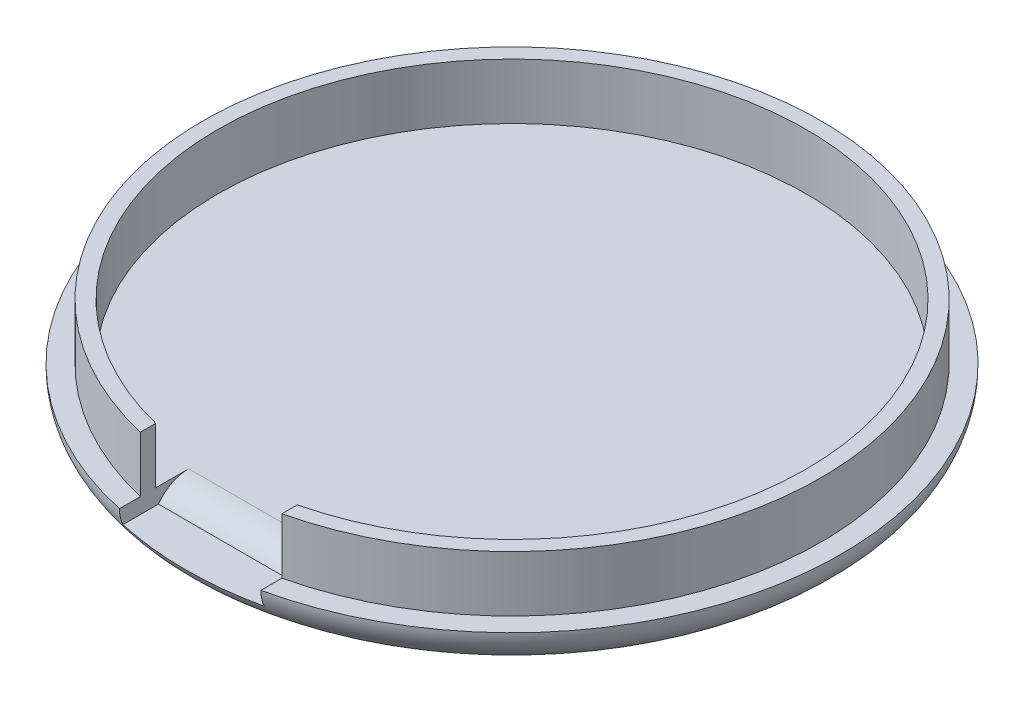
ISO-10303-21;
HEADER;
FILE_DESCRIPTION(('STEP AP214'),'2;1');
FILE_NAME('part.step','',(''),(''),'','','');
FILE_SCHEMA(('AUTOMOTIVE_DESIGN { 1 0 10303 214 1 1 1 1 }'));
ENDSEC;
DATA;
#1=APPLICATION_CONTEXT('core data for automotive mechanical design processes');
#2=APPLICATION_PROTOCOL_DEFINITION('international standard','automotive_design',2000,#1);
#3=PRODUCT_CONTEXT('',#1,'mechanical');
#4=PRODUCT('Part','Part','',(#3));
#5=PRODUCT_RELATED_PRODUCT_CATEGORY('part','',(#4));
#6=PRODUCT_DEFINITION_FORMATION('','',#4);
#7=PRODUCT_DEFINITION_CONTEXT('part definition',#1,'design');
#8=PRODUCT_DEFINITION('design','',#6,#7);
#9=PRODUCT_DEFINITION_SHAPE('','',#8);
#10=(LENGTH_UNIT() NAMED_UNIT(*) SI_UNIT(.MILLI.,.METRE.));
#11=(NAMED_UNIT(*) PLANE_ANGLE_UNIT() SI_UNIT($,.RADIAN.));
#12=(NAMED_UNIT(*) SI_UNIT($,.STERADIAN.) SOLID_ANGLE_UNIT());
#13=UNCERTAINTY_MEASURE_WITH_UNIT(LENGTH_MEASURE(1.E-05),#10,'distance_accuracy_value','');
#14=(GEOMETRIC_REPRESENTATION_CONTEXT(3) GLOBAL_UNCERTAINTY_ASSIGNED_CONTEXT((#13)) GLOBAL_UNIT_ASSIGNED_CONTEXT((#10,
#11,#12)) REPRESENTATION_CONTEXT('',''));
#15=CARTESIAN_POINT('',(0.,0.,0.));
#16=DIRECTION('',(0.,0.,1.));
#17=DIRECTION('',(1.,0.,0.));
#18=AXIS2_PLACEMENT_3D('',#15,#16,#17);
#19=CARTESIAN_POINT('',(0.,2.,0.));
#20=DIRECTION('',(0.,1.,0.));
#21=DIRECTION('',(0.,0.,1.));
#22=AXIS2_PLACEMENT_3D('',#19,#20,#21);
#23=PLANE('',#22);
#24=DIRECTION('',(0.,0.,-1.));
#25=VECTOR('',#24,1.);
#26=CARTESIAN_POINT('',(3.79990090149872,2.,0.));
#27=LINE('',#26,#25);
#28=CARTESIAN_POINT('',(3.79990090149872,2.,17.297538933004));
#29=VERTEX_POINT('',#28);
#30=CARTESIAN_POINT('',(3.79990090149872,2.,16.1695038000178));
#31=VERTEX_POINT('',#30);
#32=EDGE_CURVE('E190',#29,#31,#27,.T.);
#33=ORIENTED_EDGE('',*,*,#32,.F.);
#34=CARTESIAN_POINT('',(0.,2.,0.));
#35=DIRECTION('',(0.,1.,0.));
#36=DIRECTION('',(0.,0.,1.));
#37=AXIS2_PLACEMENT_3D('',#34,#35,#36);
#38=CIRCLE('',#37,17.71);
#39=CARTESIAN_POINT('',(-3.79990090149873,2.,17.297538933004));
#40=VERTEX_POINT('',#39);
#41=EDGE_CURVE('E165',#29,#40,#38,.T.);
#42=ORIENTED_EDGE('',*,*,#41,.T.);
#43=DIRECTION('',(0.,0.,1.));
#44=VECTOR('',#43,1.);
#45=CARTESIAN_POINT('',(-3.79990090149873,2.,0.));
#46=LINE('',#45,#44);
#47=CARTESIAN_POINT('',(-3.79990090149873,2.,16.1695038000178));
#48=VERTEX_POINT('',#47);
#49=EDGE_CURVE('E200',#48,#40,#46,.T.);
#50=ORIENTED_EDGE('',*,*,#49,.F.);
#51=CARTESIAN_POINT('',(0.,2.,0.));
#52=DIRECTION('',(0.,1.,0.));
#53=DIRECTION('',(0.,0.,1.));
#54=AXIS2_PLACEMENT_3D('',#51,#52,#53);
#55=CIRCLE('',#54,16.61);
#56=EDGE_CURVE('E172',#48,#31,#55,.F.);
#57=ORIENTED_EDGE('',*,*,#56,.T.);
#58=EDGE_LOOP('',(#33,#42,#50,#57));
#59=FACE_BOUND('',#58,.T.);
#60=ADVANCED_FACE('F35',(#59),#23,.T.);
#61=CARTESIAN_POINT('',(0.,0.,0.));
#62=DIRECTION('',(0.,1.,0.));
#63=DIRECTION('',(0.,0.,1.));
#64=AXIS2_PLACEMENT_3D('',#61,#62,#63);
#65=PLANE('',#64);
#66=CARTESIAN_POINT('',(0.,0.,0.));
#67=DIRECTION('',(0.,1.,0.));
#68=DIRECTION('',(0.,0.,1.));
#69=AXIS2_PLACEMENT_3D('',#66,#67,#68);
#70=CIRCLE('',#69,15.71);
#71=CARTESIAN_POINT('',(0.,0.,15.71));
#72=VERTEX_POINT('',#71);
#73=EDGE_CURVE('E160',#72,#72,#70,.F.);
#74=ORIENTED_EDGE('',*,*,#73,.T.);
#75=EDGE_LOOP('',(#74));
#76=FACE_BOUND('',#75,.T.);
#77=ADVANCED_FACE('F150',(#76),#65,.F.);
#78=CARTESIAN_POINT('',(0.,5.,0.));
#79=DIRECTION('',(0.,-1.,0.));
#80=DIRECTION('',(0.,0.,-1.));
#81=AXIS2_PLACEMENT_3D('',#78,#79,#80);
#82=CYLINDRICAL_SURFACE('',#81,15.81);
#83=DIRECTION('',(0.,-1.,0.));
#84=VECTOR('',#83,1.);
#85=CARTESIAN_POINT('',(3.79990090149872,5.,15.346558348333));
#86=LINE('',#85,#84);
#87=CARTESIAN_POINT('',(3.79990090149872,5.,15.346558348333));
#88=VERTEX_POINT('',#87);
#89=CARTESIAN_POINT('',(3.79990090149872,2.,15.346558348333));
#90=VERTEX_POINT('',#89);
#91=EDGE_CURVE('E183',#88,#90,#86,.T.);
#92=ORIENTED_EDGE('',*,*,#91,.F.);
#93=CARTESIAN_POINT('',(0.,5.,0.));
#94=DIRECTION('',(0.,1.,0.));
#95=DIRECTION('',(0.,0.,1.));
#96=AXIS2_PLACEMENT_3D('',#93,#94,#95);
#97=CIRCLE('',#96,15.81);
#98=CARTESIAN_POINT('',(-3.79990090149873,5.,15.346558348333));
#99=VERTEX_POINT('',#98);
#100=EDGE_CURVE('E179',#88,#99,#97,.T.);
#101=ORIENTED_EDGE('',*,*,#100,.T.);
#102=DIRECTION('',(0.,-1.,0.));
#103=VECTOR('',#102,1.);
#104=CARTESIAN_POINT('',(-3.79990090149873,5.,15.346558348333));
#105=LINE('',#104,#103);
#106=CARTESIAN_POINT('',(-3.79990090149873,2.,15.346558348333));
#107=VERTEX_POINT('',#106);
#108=EDGE_CURVE('E193',#107,#99,#105,.F.);
#109=ORIENTED_EDGE('',*,*,#108,.F.);
#110=CARTESIAN_POINT('',(0.,2.,0.));
#111=DIRECTION('',(0.,1.,0.));
#112=DIRECTION('',(0.,0.,1.));
#113=AXIS2_PLACEMENT_3D('',#110,#111,#112);
#114=CIRCLE('',#113,15.81);
#115=EDGE_CURVE('E162',#107,#90,#114,.F.);
#116=ORIENTED_EDGE('',*,*,#115,.T.);
#117=EDGE_LOOP('',(#92,#101,#109,#116));
#118=FACE_BOUND('',#117,.T.);
#119=ADVANCED_FACE('F146',(#118),#82,.F.);
#120=CARTESIAN_POINT('',(0.,5.,0.));
#121=DIRECTION('',(0.,-1.,0.));
#122=DIRECTION('',(0.,0.,-1.));
#123=AXIS2_PLACEMENT_3D('',#120,#121,#122);
#124=CYLINDRICAL_SURFACE('',#123,16.61);
#125=CARTESIAN_POINT('',(0.,5.,0.));
#126=DIRECTION('',(0.,1.,0.));
#127=DIRECTION('',(0.,0.,1.));
#128=AXIS2_PLACEMENT_3D('',#125,#126,#127);
#129=CIRCLE('',#128,16.61);
#130=CARTESIAN_POINT('',(3.79990090149872,5.,16.1695038000178));
#131=VERTEX_POINT('',#130);
#132=CARTESIAN_POINT('',(-3.79990090149873,5.,16.1695038000178));
#133=VERTEX_POINT('',#132);
#134=EDGE_CURVE('E176',#131,#133,#129,.T.);
#135=ORIENTED_EDGE('',*,*,#134,.F.);
#136=DIRECTION('',(0.,-1.,0.));
#137=VECTOR('',#136,1.);
#138=CARTESIAN_POINT('',(3.79990090149872,5.,16.1695038000178));
#139=LINE('',#138,#137);
#140=EDGE_CURVE('E187',#131,#31,#139,.T.);
#141=ORIENTED_EDGE('',*,*,#140,.T.);
#142=ORIENTED_EDGE('',*,*,#56,.F.);
#143=DIRECTION('',(0.,-1.,0.));
#144=VECTOR('',#143,1.);
#145=CARTESIAN_POINT('',(-3.79990090149873,5.,16.1695038000178));
#146=LINE('',#145,#144);
#147=EDGE_CURVE('E197',#48,#133,#146,.F.);
#148=ORIENTED_EDGE('',*,*,#147,.T.);
#149=EDGE_LOOP('',(#135,#141,#142,#148));
#150=FACE_BOUND('',#149,.T.);
#151=ADVANCED_FACE('F142',(#150),#124,.T.);
#152=CARTESIAN_POINT('',(0.,5.,0.));
#153=DIRECTION('',(0.,1.,0.));
#154=DIRECTION('',(0.,0.,1.));
#155=AXIS2_PLACEMENT_3D('',#152,#153,#154);
#156=PLANE('',#155);
#157=DIRECTION('',(0.,0.,-1.));
#158=VECTOR('',#157,1.);
#159=CARTESIAN_POINT('',(3.79990090149872,5.,0.));
#160=LINE('',#159,#158);
#161=EDGE_CURVE('E185',#131,#88,#160,.T.);
#162=ORIENTED_EDGE('',*,*,#161,.F.);
#163=ORIENTED_EDGE('',*,*,#134,.T.);
#164=DIRECTION('',(0.,0.,1.));
#165=VECTOR('',#164,1.);
#166=CARTESIAN_POINT('',(-3.79990090149873,5.,0.));
#167=LINE('',#166,#165);
#168=EDGE_CURVE('E195',#99,#133,#167,.T.);
#169=ORIENTED_EDGE('',*,*,#168,.F.);
#170=ORIENTED_EDGE('',*,*,#100,.F.);
#171=EDGE_LOOP('',(#162,#163,#169,#170));
#172=FACE_BOUND('',#171,.T.);
#173=ADVANCED_FACE('F138',(#172),#156,.T.);
#174=DIRECTION('',(-1.,0.,0.));
#175=VECTOR('',#174,1.);
#176=CARTESIAN_POINT('',(3.79990090149872,2.,13.5754361979311));
#177=LINE('',#176,#175);
#178=CARTESIAN_POINT('',(-3.79990090149873,2.,13.5754361979311));
#179=VERTEX_POINT('',#178);
#180=CARTESIAN_POINT('',(3.79990090149872,2.,13.5754361979311));
#181=VERTEX_POINT('',#180);
#182=EDGE_CURVE('E117',#179,#181,#177,.F.);
#183=ORIENTED_EDGE('',*,*,#182,.T.);
#184=DIRECTION('',(0.,0.,-1.));
#185=VECTOR('',#184,1.);
#186=CARTESIAN_POINT('',(3.79990090149872,2.,0.));
#187=LINE('',#186,#185);
#188=EDGE_CURVE('E50',#90,#181,#187,.T.);
#189=ORIENTED_EDGE('',*,*,#188,.F.);
#190=ORIENTED_EDGE('',*,*,#115,.F.);
#191=DIRECTION('',(0.,0.,1.));
#192=VECTOR('',#191,1.);
#193=CARTESIAN_POINT('',(-3.79990090149873,2.,0.));
#194=LINE('',#193,#192);
#195=EDGE_CURVE('E58',#179,#107,#194,.T.);
#196=ORIENTED_EDGE('',*,*,#195,.F.);
#197=EDGE_LOOP('',(#183,#189,#190,#196));
#198=FACE_BOUND('',#197,.T.);
#199=ADVANCED_FACE('F141',(#198),#23,.T.);
#200=CARTESIAN_POINT('',(0.,2.,0.));
#201=DIRECTION('',(0.,1.,0.));
#202=DIRECTION('',(0.,0.,1.));
#203=AXIS2_PLACEMENT_3D('',#200,#201,#202);
#204=TOROIDAL_SURFACE('',#203,15.71,2.);
#205=CARTESIAN_POINT('',(3.79990090149872,1.45357338934888,17.21962332699));
#206=CARTESIAN_POINT('',(3.79990090149872,1.55909586418765,17.2503096759754));
#207=CARTESIAN_POINT('',(3.79990090149872,1.66727453883476,17.2721334523827));
#208=CARTESIAN_POINT('',(3.79990090149872,1.88584423233021,17.2973056340337));
#209=CARTESIAN_POINT('',(3.79990090149872,1.99623752000177,17.3006340073255));
#210=CARTESIAN_POINT('',(3.79990090149872,2.21596992925402,17.288676552464));
#211=CARTESIAN_POINT('',(3.79990090149872,2.32530950168318,17.2733990771935));
#212=CARTESIAN_POINT('',(3.79990090149872,2.53984843586485,17.2247319097804));
#213=CARTESIAN_POINT('',(3.79990090149872,2.6450486697975,17.1913460553245));
#214=CARTESIAN_POINT('',(3.79990090149872,2.84858217498425,17.1074431458221));
#215=CARTESIAN_POINT('',(3.79990090149872,2.94690349699315,17.0568971316387));
#216=CARTESIAN_POINT('',(3.79990090149872,3.13382734075521,16.9402385917093));
#217=CARTESIAN_POINT('',(3.79990090149872,3.22242905170772,16.8741247687568));
#218=CARTESIAN_POINT('',(3.79990090149872,3.38880978666186,16.7272380923458));
#219=CARTESIAN_POINT('',(3.79990090149872,3.46641373876168,16.6462670455605));
#220=CARTESIAN_POINT('',(3.79990090149872,3.6072962059187,16.4727041275442));
#221=CARTESIAN_POINT('',(3.79990090149872,3.6705732039896,16.3801110273428));
#222=CARTESIAN_POINT('',(3.79990090149872,3.78258895880838,16.1836481680994));
#223=CARTESIAN_POINT('',(3.79990090149872,3.83095577598188,16.0795663906719));
#224=CARTESIAN_POINT('',(3.79990090149872,3.91001022130043,15.8648952753294));
#225=CARTESIAN_POINT('',(3.79990090149872,3.94069556383107,15.7543050981346));
#226=CARTESIAN_POINT('',(3.79990090149872,3.98428233712657,15.526812178211));
#227=CARTESIAN_POINT('',(3.79990090149872,3.99672160402524,15.4098208063365));
#228=CARTESIAN_POINT('',(3.79990090149872,4.00214386388399,15.1753846331675));
#229=CARTESIAN_POINT('',(3.79990090149872,3.99512456339262,15.0579397800534));
#230=CARTESIAN_POINT('',(3.79990090149872,3.96157500587618,14.8238076942345));
#231=CARTESIAN_POINT('',(3.79990090149872,3.93471260390865,14.7071678977497));
#232=CARTESIAN_POINT('',(3.79990090149872,3.861789318393,14.4800415578292));
#233=CARTESIAN_POINT('',(3.79990090149872,3.81572758398368,14.3695552873469));
#234=CARTESIAN_POINT('',(3.79990090149872,3.70556992963698,14.158004701468));
#235=CARTESIAN_POINT('',(3.79990090149872,3.64148025322444,14.0569371402422));
#236=CARTESIAN_POINT('',(3.79990090149872,3.49688261935646,13.8673061423101));
#237=CARTESIAN_POINT('',(3.79990090149872,3.41637626166515,13.7787414886489));
#238=CARTESIAN_POINT('',(3.79990090149872,3.24305530419661,13.6188574154341));
#239=CARTESIAN_POINT('',(3.79990090149872,3.15055497582705,13.5471976680327));
#240=CARTESIAN_POINT('',(3.79990090149872,2.95446350933796,13.4211190226991));
#241=CARTESIAN_POINT('',(3.79990090149872,2.85087493783048,13.3666961464196));
#242=CARTESIAN_POINT('',(3.79990090149872,2.63958815916983,13.2787408523047));
#243=CARTESIAN_POINT('',(3.79990090149872,2.53217586334589,13.2445214826704));
#244=CARTESIAN_POINT('',(3.79990090149872,2.313047292227,13.1952349124222));
#245=CARTESIAN_POINT('',(3.79990090149872,2.20133191861439,13.1801637216829));
#246=CARTESIAN_POINT('',(3.79990090149872,1.9803826922986,13.169899332866));
#247=CARTESIAN_POINT('',(3.79990090149872,1.87117565234514,13.1741201621568));
#248=CARTESIAN_POINT('',(3.79990090149872,1.65505223143836,13.2009497596299));
#249=CARTESIAN_POINT('',(3.79990090149872,1.54813571821885,13.2235574631109));
#250=CARTESIAN_POINT('',(3.79990090149872,1.34016288733574,13.2861849316647));
#251=CARTESIAN_POINT('',(3.79990090149872,1.23907858751597,13.3261120524875));
#252=CARTESIAN_POINT('',(3.79990090149872,1.04484247616271,13.4220135849093));
#253=CARTESIAN_POINT('',(3.79990090149872,0.951691371445831,13.4779894244502));
#254=CARTESIAN_POINT('',(3.79990090149872,0.773703456513137,13.605624735844));
#255=CARTESIAN_POINT('',(3.79990090149872,0.689095600426226,13.6776031710134));
#256=CARTESIAN_POINT('',(3.79990090149872,0.532645526756728,13.8342980390209));
#257=CARTESIAN_POINT('',(3.79990090149872,0.460805457036375,13.9190166106527));
#258=CARTESIAN_POINT('',(3.79990090149872,0.329223521689638,14.1020182470237));
#259=CARTESIAN_POINT('',(3.79990090149872,0.270004562294888,14.2006773471609));
#260=CARTESIAN_POINT('',(3.79990090149872,0.168401450266284,14.406313947249));
#261=CARTESIAN_POINT('',(3.79990090149872,0.126020151188883,14.5132928535257));
#262=CARTESIAN_POINT('',(3.79990090149872,0.0580615975633666,14.7360176893053));
#263=CARTESIAN_POINT('',(3.79990090149872,0.0330319102312837,14.8519309837083));
#264=CARTESIAN_POINT('',(3.79990090149872,0.00253297442443076,15.0863086589953));
#265=CARTESIAN_POINT('',(3.79990090149872,-0.00293447463066497,15.2047732735526));
#266=CARTESIAN_POINT('',(3.79990090149872,0.00595266390752267,15.4423581002478));
#267=CARTESIAN_POINT('',(3.79990090149872,0.0205401291745903,15.5614697438153));
#268=CARTESIAN_POINT('',(3.79990090149872,0.0696863798811369,15.7955028225322));
#269=CARTESIAN_POINT('',(3.79990090149872,0.104243960270379,15.91042451007));
#270=CARTESIAN_POINT('',(3.79990090149872,0.192127575140095,16.1316436114345));
#271=CARTESIAN_POINT('',(3.79990090149872,0.24527894805595,16.2380103282585));
#272=CARTESIAN_POINT('',(3.79990090149872,0.369099091693861,16.4400552516471));
#273=CARTESIAN_POINT('',(3.79990090149872,0.439770293664347,16.5357319720721));
#274=CARTESIAN_POINT('',(3.79990090149872,0.594952888060608,16.7113363033054));
#275=CARTESIAN_POINT('',(3.79990090149872,0.679122544554703,16.7915661566621));
#276=CARTESIAN_POINT('',(3.79990090149872,0.859980286420135,16.9362204332253));
#277=CARTESIAN_POINT('',(3.79990090149872,0.956650721231062,17.0006667776569));
#278=CARTESIAN_POINT('',(3.79990090149872,1.12082552110518,17.0904717164297));
#279=CARTESIAN_POINT('',(3.79990090149872,1.18536863959636,17.1213584372691));
#280=CARTESIAN_POINT('',(3.79990090149872,1.31742440583357,17.1759543257529));
#281=CARTESIAN_POINT('',(3.79990090149872,1.3849370098692,17.1996635990077));
#282=CARTESIAN_POINT('',(3.79990090149872,1.45357338934888,17.21962332699));
#283=B_SPLINE_CURVE_WITH_KNOTS('',3,(#205,#206,#207,#208,#209,#210,#211,#212,#213,#214,#215,
#216,#217,#218,#219,#220,#221,#222,#223,#224,#225,#226,#227,#228,#229,#230,#231,#232,#233,#234,
#235,#236,#237,#238,#239,#240,#241,#242,#243,#244,#245,#246,#247,#248,#249,#250,#251,#252,#253,
#254,#255,#256,#257,#258,#259,#260,#261,#262,#263,#264,#265,#266,#267,#268,#269,#270,#271,#272,
#273,#274,#275,#276,#277,#278,#279,#280,#281,#282),.UNSPECIFIED.,.T.,.F.,(4,2,2,2,2,2,2,2,2,2,2,
2,2,2,2,2,2,2,2,2,2,2,2,2,2,2,2,2,2,2,2,2,2,2,2,2,2,2,4),(0.,0.329421289812054,
0.659199298919161,0.988829312521508,1.31838949531578,1.64850862481153,1.97865527162189,
2.3135770715642,2.64853431759123,2.99127395960361,3.33405789628294,3.68538281933831,
4.03674915247776,4.39413406231655,4.75153481214806,5.108811937279,5.46605426327995,
5.8153354200719,6.16453590235686,6.50105338453361,6.83750073120112,7.16379796113424,
7.4900762980058,7.81463043791221,8.13921346413592,8.47096226193554,8.80276681549566,
9.14640602175722,9.49010344133252,9.84420592948295,10.1983409886815,10.5566231807603,
10.9148837553891,11.2698655632017,11.6248966598827,11.9720532998581,12.3187250151139,
12.5329980162397,12.7472678643529),.UNSPECIFIED.);
#284=CARTESIAN_POINT('',(3.79990090149872,1.16653009091376,17.1112098662958));
#285=VERTEX_POINT('',#284);
#286=EDGE_CURVE('E118',#285,#29,#283,.T.);
#287=ORIENTED_EDGE('',*,*,#286,.F.);
#288=CARTESIAN_POINT('',(0.,1.16653009091376,0.));
#289=DIRECTION('',(0.,-1.,0.));
#290=DIRECTION('',(0.,0.,-1.));
#291=AXIS2_PLACEMENT_3D('',#288,#289,#290);
#292=CIRCLE('',#291,17.5280560801713);
#293=CARTESIAN_POINT('',(-3.79990090149873,1.16653009091376,17.1112098662951));
#294=VERTEX_POINT('',#293);
#295=EDGE_CURVE('E120',#294,#285,#292,.F.);
#296=ORIENTED_EDGE('',*,*,#295,.F.);
#297=CARTESIAN_POINT('',(-3.79990090149873,1.45357338934888,17.21962332699));
#298=CARTESIAN_POINT('',(-3.79990090149873,1.34629152423832,17.188414308374));
#299=CARTESIAN_POINT('',(-3.79990090149873,1.24159528768838,17.1479963675278));
#300=CARTESIAN_POINT('',(-3.79990090149873,1.04044700336024,17.0500179590168));
#301=CARTESIAN_POINT('',(-3.79990090149873,0.94400639987595,16.9924341752902));
#302=CARTESIAN_POINT('',(-3.79990090149873,0.762241364366128,16.8620267138688));
#303=CARTESIAN_POINT('',(-3.79990090149873,0.676902366675475,16.7892233387057));
#304=CARTESIAN_POINT('',(-3.79990090149873,0.51945441486585,16.6305499948482));
#305=CARTESIAN_POINT('',(-3.79990090149873,0.447342419442704,16.5446830382102));
#306=CARTESIAN_POINT('',(-3.79990090149873,0.317069382111451,16.360903316469));
#307=CARTESIAN_POINT('',(-3.79990090149873,0.259146579692917,16.2628217713185));
#308=CARTESIAN_POINT('',(-3.79990090149873,0.160118713158147,16.0585063807625));
#309=CARTESIAN_POINT('',(-3.79990090149873,0.119016401007097,15.9522712047323));
#310=CARTESIAN_POINT('',(-3.79990090149873,0.0537153717804883,15.7317891308455));
#311=CARTESIAN_POINT('',(-3.79990090149873,0.0299719259082982,15.6174073563466));
#312=CARTESIAN_POINT('',(-3.79990090149873,0.00159917355339848,15.3862959418815));
#313=CARTESIAN_POINT('',(-3.79990090149873,-0.00302772572389985,15.2695660080885));
#314=CARTESIAN_POINT('',(-3.79990090149873,0.00696654945713649,15.0345236917546));
#315=CARTESIAN_POINT('',(-3.79990090149873,0.0219850282324743,14.9162280525714));
#316=CARTESIAN_POINT('',(-3.79990090149873,0.0715426304439568,14.6837904540659));
#317=CARTESIAN_POINT('',(-3.79990090149873,0.10608314567633,14.5696487915132));
#318=CARTESIAN_POINT('',(-3.79990090149873,0.194074598749454,14.3481296894117));
#319=CARTESIAN_POINT('',(-3.79990090149873,0.247632915382773,14.2407948245465));
#320=CARTESIAN_POINT('',(-3.79990090149873,0.372284016201539,14.0368260347919));
#321=CARTESIAN_POINT('',(-3.79990090149873,0.44337595727493,13.9401915956915));
#322=CARTESIAN_POINT('',(-3.79990090149873,0.59999471975306,13.7621280337971));
#323=CARTESIAN_POINT('',(-3.79990090149873,0.685274570175832,13.6804819520027));
#324=CARTESIAN_POINT('',(-3.79990090149873,0.868746917698568,13.5332711492661));
#325=CARTESIAN_POINT('',(-3.79990090149873,0.966936796654288,13.4677031753994));
#326=CARTESIAN_POINT('',(-3.79990090149873,1.16989960002781,13.3569263974342));
#327=CARTESIAN_POINT('',(-3.79990090149873,1.27433746217891,13.3111039041056));
#328=CARTESIAN_POINT('',(-3.79990090149873,1.48959834245684,13.2383577604192));
#329=CARTESIAN_POINT('',(-3.79990090149873,1.6004198586143,13.2114296840087));
#330=CARTESIAN_POINT('',(-3.79990090149873,1.82119661336098,13.1780829166381));
#331=CARTESIAN_POINT('',(-3.79990090149873,1.93105045070517,13.1709904043522));
#332=CARTESIAN_POINT('',(-3.79990090149873,2.15035193535411,13.1756382521235));
#333=CARTESIAN_POINT('',(-3.79990090149873,2.25979962508486,13.1873765862485));
#334=CARTESIAN_POINT('',(-3.79990090149873,2.47360573905176,13.2289575080397));
#335=CARTESIAN_POINT('',(-3.79990090149873,2.57801374159728,13.2585463234789));
#336=CARTESIAN_POINT('',(-3.79990090149873,2.78048911407645,13.3345834748136));
#337=CARTESIAN_POINT('',(-3.79990090149873,2.87855616501633,13.3810326581262));
#338=CARTESIAN_POINT('',(-3.79990090149873,3.06719068722799,13.4900717957213));
#339=CARTESIAN_POINT('',(-3.79990090149873,3.15762615844089,13.5528897855042));
#340=CARTESIAN_POINT('',(-3.79990090149873,3.32710753009857,13.6923561246098));
#341=CARTESIAN_POINT('',(-3.79990090149873,3.40615168312635,13.7690065917679));
#342=CARTESIAN_POINT('',(-3.79990090149873,3.55344690408228,13.9366939139531));
#343=CARTESIAN_POINT('',(-3.79990090149873,3.62124613151296,14.0281275905813));
#344=CARTESIAN_POINT('',(-3.79990090149873,3.74112656725084,14.220774173281));
#345=CARTESIAN_POINT('',(-3.79990090149873,3.79320499105393,14.3219888075917));
#346=CARTESIAN_POINT('',(-3.79990090149873,3.88193142525328,14.5349957102045));
#347=CARTESIAN_POINT('',(-3.79990090149873,3.91800021408484,14.6470295105378));
#348=CARTESIAN_POINT('',(-3.79990090149873,3.97119533362603,14.8755114087289));
#349=CARTESIAN_POINT('',(-3.79990090149873,3.98831941381637,14.9919600293421));
#350=CARTESIAN_POINT('',(-3.79990090149873,4.00329506885448,15.2282074936645));
#351=CARTESIAN_POINT('',(-3.79990090149873,4.00079402091737,15.3480289048532));
#352=CARTESIAN_POINT('',(-3.79990090149873,3.9756502906539,15.5855475419302));
#353=CARTESIAN_POINT('',(-3.79990090149873,3.95300731928863,15.703244737311));
#354=CARTESIAN_POINT('',(-3.79990090149873,3.88815796205008,15.9327176640664));
#355=CARTESIAN_POINT('',(-3.79990090149873,3.84601550032831,16.0445114241968));
#356=CARTESIAN_POINT('',(-3.79990090149873,3.74319196756925,16.2592297050747));
#357=CARTESIAN_POINT('',(-3.79990090149873,3.68251259338335,16.3621550365245));
#358=CARTESIAN_POINT('',(-3.79990090149873,3.54556044484252,16.5540076976934));
#359=CARTESIAN_POINT('',(-3.79990090149873,3.46961743620935,16.6431703052442));
#360=CARTESIAN_POINT('',(-3.79990090149873,3.30348563697011,16.8070543062865));
#361=CARTESIAN_POINT('',(-3.79990090149873,3.21329949397125,16.881778377979));
#362=CARTESIAN_POINT('',(-3.79990090149873,3.02375561608504,17.0126157941864));
#363=CARTESIAN_POINT('',(-3.79990090149873,2.92469598467544,17.0691610963412));
#364=CARTESIAN_POINT('',(-3.79990090149873,2.71830357686864,17.1644036860134));
#365=CARTESIAN_POINT('',(-3.79990090149873,2.61096973809479,17.2030986771492));
#366=CARTESIAN_POINT('',(-3.79990090149873,2.3935807147384,17.2607171700527));
#367=CARTESIAN_POINT('',(-3.79990090149873,2.28363197363666,17.2800437083757));
#368=CARTESIAN_POINT('',(-3.79990090149873,2.06214829259441,17.2997034402652));
#369=CARTESIAN_POINT('',(-3.79990090149873,1.95061570338994,17.3000623299867));
#370=CARTESIAN_POINT('',(-3.79990090149873,1.77455458982579,17.2855997012754));
#371=CARTESIAN_POINT('',(-3.79990090149873,1.70946120937767,17.2769277835438));
#372=CARTESIAN_POINT('',(-3.79990090149873,1.5804724413048,17.2531036486433));
#373=CARTESIAN_POINT('',(-3.79990090149873,1.51657703848249,17.2379515137405));
#374=CARTESIAN_POINT('',(-3.79990090149873,1.45357338934888,17.21962332699));
#375=B_SPLINE_CURVE_WITH_KNOTS('',3,(#297,#298,#299,#300,#301,#302,#303,#304,#305,#306,#307,
#308,#309,#310,#311,#312,#313,#314,#315,#316,#317,#318,#319,#320,#321,#322,#323,#324,#325,#326,
#327,#328,#329,#330,#331,#332,#333,#334,#335,#336,#337,#338,#339,#340,#341,#342,#343,#344,#345,
#346,#347,#348,#349,#350,#351,#352,#353,#354,#355,#356,#357,#358,#359,#360,#361,#362,#363,#364,
#365,#366,#367,#368,#369,#370,#371,#372,#373,#374),.UNSPECIFIED.,.T.,.F.,(4,2,2,2,2,2,2,2,2,2,2,
2,2,2,2,2,2,2,2,2,2,2,2,2,2,2,2,2,2,2,2,2,2,2,2,2,2,2,4),(0.,0.33494215709317,0.670341349379082,
1.00529595085163,1.3401734389078,1.68033811990798,2.02055843231088,2.36940963293832,
2.7183047604803,3.07436613708918,3.43045290179753,3.78858304664808,4.14669597400918,
4.49912598315714,4.85148462968469,5.19192344738462,5.53228249000207,5.86093018826212,
6.18954253105862,6.51358974513238,6.8376532483618,7.16649810843317,7.49539335941033,
7.8353385748988,8.1753439669668,8.52680882761789,8.87831543573298,9.23615215818638,
9.59399401572079,9.95067100116459,10.3073153465138,10.6569531037098,11.0065259442794,
11.3470432957834,11.6876044414707,12.0209217935377,12.3537875770224,12.5504922671976,
12.7471944602831),.UNSPECIFIED.);
#376=EDGE_CURVE('E105',#40,#294,#375,.T.);
#377=ORIENTED_EDGE('',*,*,#376,.F.);
#378=ORIENTED_EDGE('',*,*,#41,.F.);
#379=EDGE_LOOP('',(#287,#296,#377,#378));
#380=FACE_BOUND('',#379,.T.);
#381=ORIENTED_EDGE('',*,*,#73,.F.);
#382=EDGE_LOOP('',(#381));
#383=FACE_BOUND('',#382,.T.);
#384=ADVANCED_FACE('F128',(#380,#383),#204,.T.);
#385=CARTESIAN_POINT('',(3.79990090149872,1.16653009091376,15.2));
#386=DIRECTION('',(1.,0.,0.));
#387=DIRECTION('',(0.,0.,-1.));
#388=AXIS2_PLACEMENT_3D('',#385,#386,#387);
#389=PLANE('',#388);
#390=ORIENTED_EDGE('',*,*,#188,.T.);
#391=CARTESIAN_POINT('',(3.79990090149872,0.,13.5754361979311));
#392=DIRECTION('',(1.,0.,0.));
#393=DIRECTION('',(0.,0.,-1.));
#394=AXIS2_PLACEMENT_3D('',#391,#392,#393);
#395=CIRCLE('',#394,2.);
#396=CARTESIAN_POINT('',(3.79990090149872,1.16653009091376,15.2));
#397=VERTEX_POINT('',#396);
#398=EDGE_CURVE('E43',#181,#397,#395,.T.);
#399=ORIENTED_EDGE('',*,*,#398,.T.);
#400=DIRECTION('',(0.,0.,1.));
#401=VECTOR('',#400,1.);
#402=CARTESIAN_POINT('',(3.79990090149872,1.16653009091376,15.2));
#403=LINE('',#402,#401);
#404=EDGE_CURVE('E108',#397,#285,#403,.T.);
#405=ORIENTED_EDGE('',*,*,#404,.T.);
#406=ORIENTED_EDGE('',*,*,#286,.T.);
#407=ORIENTED_EDGE('',*,*,#32,.T.);
#408=ORIENTED_EDGE('',*,*,#140,.F.);
#409=ORIENTED_EDGE('',*,*,#161,.T.);
#410=ORIENTED_EDGE('',*,*,#91,.T.);
#411=EDGE_LOOP('',(#390,#399,#405,#406,#407,#408,#409,#410));
#412=FACE_BOUND('',#411,.T.);
#413=ADVANCED_FACE('F131',(#412),#389,.F.);
#414=CARTESIAN_POINT('',(3.79990090149872,1.16653009091376,15.2));
#415=DIRECTION('',(0.,-1.,0.));
#416=DIRECTION('',(0.,0.,-1.));
#417=AXIS2_PLACEMENT_3D('',#414,#415,#416);
#418=PLANE('',#417);
#419=ORIENTED_EDGE('',*,*,#295,.T.);
#420=ORIENTED_EDGE('',*,*,#404,.F.);
#421=DIRECTION('',(1.,0.,0.));
#422=VECTOR('',#421,1.);
#423=CARTESIAN_POINT('',(3.79990090149872,1.16653009091376,15.2));
#424=LINE('',#423,#422);
#425=CARTESIAN_POINT('',(-3.79990090149873,1.16653009091376,15.2));
#426=VERTEX_POINT('',#425);
#427=EDGE_CURVE('E109',#426,#397,#424,.T.);
#428=ORIENTED_EDGE('',*,*,#427,.F.);
#429=DIRECTION('',(0.,0.,1.));
#430=VECTOR('',#429,1.);
#431=CARTESIAN_POINT('',(-3.79990090149873,1.16653009091376,15.2));
#432=LINE('',#431,#430);
#433=EDGE_CURVE('E99',#426,#294,#432,.T.);
#434=ORIENTED_EDGE('',*,*,#433,.T.);
#435=EDGE_LOOP('',(#419,#420,#428,#434));
#436=FACE_BOUND('',#435,.T.);
#437=ADVANCED_FACE('F113',(#436),#418,.F.);
#438=CARTESIAN_POINT('',(-3.79990090149873,1.16653009091376,15.2));
#439=DIRECTION('',(-1.,0.,0.));
#440=DIRECTION('',(0.,0.,1.));
#441=AXIS2_PLACEMENT_3D('',#438,#439,#440);
#442=PLANE('',#441);
#443=ORIENTED_EDGE('',*,*,#195,.T.);
#444=ORIENTED_EDGE('',*,*,#108,.T.);
#445=ORIENTED_EDGE('',*,*,#168,.T.);
#446=ORIENTED_EDGE('',*,*,#147,.F.);
#447=ORIENTED_EDGE('',*,*,#49,.T.);
#448=ORIENTED_EDGE('',*,*,#376,.T.);
#449=ORIENTED_EDGE('',*,*,#433,.F.);
#450=CARTESIAN_POINT('',(-3.79990090149873,0.,13.5754361979311));
#451=DIRECTION('',(-1.,0.,0.));
#452=DIRECTION('',(0.,0.,1.));
#453=AXIS2_PLACEMENT_3D('',#450,#451,#452);
#454=CIRCLE('',#453,2.);
#455=EDGE_CURVE('E11',#426,#179,#454,.T.);
#456=ORIENTED_EDGE('',*,*,#455,.T.);
#457=EDGE_LOOP('',(#443,#444,#445,#446,#447,#448,#449,#456));
#458=FACE_BOUND('',#457,.T.);
#459=ADVANCED_FACE('F101',(#458),#442,.F.);
#460=CARTESIAN_POINT('',(0.,0.,13.5754361979311));
#461=DIRECTION('',(1.,0.,0.));
#462=DIRECTION('',(0.,0.,-1.));
#463=AXIS2_PLACEMENT_3D('',#460,#461,#462);
#464=CYLINDRICAL_SURFACE('',#463,2.);
#465=ORIENTED_EDGE('',*,*,#455,.F.);
#466=ORIENTED_EDGE('',*,*,#427,.T.);
#467=ORIENTED_EDGE('',*,*,#398,.F.);
#468=ORIENTED_EDGE('',*,*,#182,.F.);
#469=EDGE_LOOP('',(#465,#466,#467,#468));
#470=FACE_BOUND('',#469,.T.);
#471=ADVANCED_FACE('F37',(#470),#464,.T.);
#472=CLOSED_SHELL('',(#60,#77,#119,#151,#173,#199,#384,#413,#437,#459,#471));
#473=MANIFOLD_SOLID_BREP('B2',#472);
#474=ADVANCED_BREP_SHAPE_REPRESENTATION('',(#18,#473),#14);
#475=SHAPE_DEFINITION_REPRESENTATION(#9,#474);
ENDSEC;
END-ISO-10303-21;
